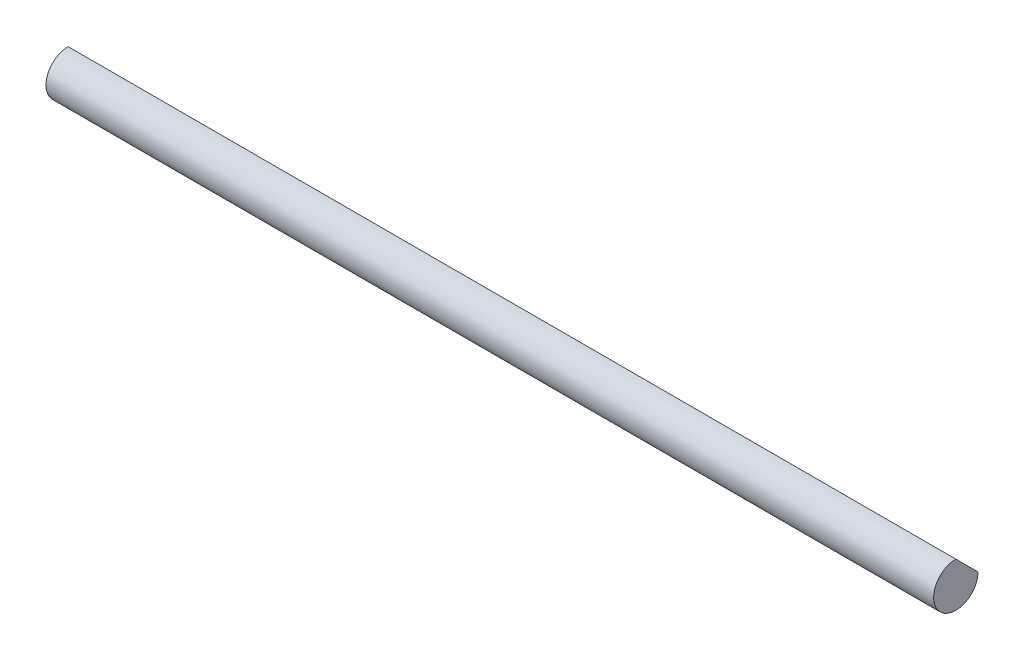
ISO-10303-21;
HEADER;
FILE_DESCRIPTION(('STEP AP214'),'2;1');
FILE_NAME('part.step','',(''),(''),'','','');
FILE_SCHEMA(('AUTOMOTIVE_DESIGN { 1 0 10303 214 1 1 1 1 }'));
ENDSEC;
DATA;
#1=APPLICATION_CONTEXT('core data for automotive mechanical design processes');
#2=APPLICATION_PROTOCOL_DEFINITION('international standard','automotive_design',2000,#1);
#3=PRODUCT_CONTEXT('',#1,'mechanical');
#4=PRODUCT('Part','Part','',(#3));
#5=PRODUCT_RELATED_PRODUCT_CATEGORY('part','',(#4));
#6=PRODUCT_DEFINITION_FORMATION('','',#4);
#7=PRODUCT_DEFINITION_CONTEXT('part definition',#1,'design');
#8=PRODUCT_DEFINITION('design','',#6,#7);
#9=PRODUCT_DEFINITION_SHAPE('','',#8);
#10=(LENGTH_UNIT() NAMED_UNIT(*) SI_UNIT(.MILLI.,.METRE.));
#11=(NAMED_UNIT(*) PLANE_ANGLE_UNIT() SI_UNIT($,.RADIAN.));
#12=(NAMED_UNIT(*) SI_UNIT($,.STERADIAN.) SOLID_ANGLE_UNIT());
#13=UNCERTAINTY_MEASURE_WITH_UNIT(LENGTH_MEASURE(1.E-05),#10,'distance_accuracy_value','');
#14=(GEOMETRIC_REPRESENTATION_CONTEXT(3) GLOBAL_UNCERTAINTY_ASSIGNED_CONTEXT((#13)) GLOBAL_UNIT_ASSIGNED_CONTEXT((#10,
#11,#12)) REPRESENTATION_CONTEXT('',''));
#15=CARTESIAN_POINT('',(0.,0.,0.));
#16=DIRECTION('',(0.,0.,1.));
#17=DIRECTION('',(1.,0.,0.));
#18=AXIS2_PLACEMENT_3D('',#15,#16,#17);
#19=CARTESIAN_POINT('',(127.,0.,0.));
#20=DIRECTION('',(-1.,0.,0.));
#21=DIRECTION('',(0.,0.,1.));
#22=AXIS2_PLACEMENT_3D('',#19,#20,#21);
#23=CYLINDRICAL_SURFACE('',#22,3.175);
#24=CARTESIAN_POINT('',(0.,0.,0.));
#25=DIRECTION('',(1.,0.,0.));
#26=DIRECTION('',(0.,0.,-1.));
#27=AXIS2_PLACEMENT_3D('',#24,#25,#26);
#28=CIRCLE('',#27,3.175);
#29=CARTESIAN_POINT('',(0.,3.175,0.));
#30=VERTEX_POINT('',#29);
#31=CARTESIAN_POINT('',(0.,0.,-3.175));
#32=VERTEX_POINT('',#31);
#33=EDGE_CURVE('E67',#30,#32,#28,.T.);
#34=ORIENTED_EDGE('',*,*,#33,.T.);
#35=DIRECTION('',(-1.,0.,0.));
#36=VECTOR('',#35,1.);
#37=CARTESIAN_POINT('',(127.,0.,-3.175));
#38=LINE('',#37,#36);
#39=CARTESIAN_POINT('',(127.,0.,-3.175));
#40=VERTEX_POINT('',#39);
#41=EDGE_CURVE('E11',#40,#32,#38,.T.);
#42=ORIENTED_EDGE('',*,*,#41,.F.);
#43=CARTESIAN_POINT('',(127.,0.,0.));
#44=DIRECTION('',(1.,0.,0.));
#45=DIRECTION('',(0.,0.,-1.));
#46=AXIS2_PLACEMENT_3D('',#43,#44,#45);
#47=CIRCLE('',#46,3.175);
#48=CARTESIAN_POINT('',(127.,3.175,0.));
#49=VERTEX_POINT('',#48);
#50=EDGE_CURVE('E66',#49,#40,#47,.T.);
#51=ORIENTED_EDGE('',*,*,#50,.F.);
#52=DIRECTION('',(-1.,0.,0.));
#53=VECTOR('',#52,1.);
#54=CARTESIAN_POINT('',(127.,3.175,0.));
#55=LINE('',#54,#53);
#56=EDGE_CURVE('E44',#49,#30,#55,.T.);
#57=ORIENTED_EDGE('',*,*,#56,.T.);
#58=EDGE_LOOP('',(#34,#42,#51,#57));
#59=FACE_BOUND('',#58,.T.);
#60=ADVANCED_FACE('F36',(#59),#23,.T.);
#61=CARTESIAN_POINT('',(127.,3.175,0.));
#62=DIRECTION('',(0.,-0.707106781186548,0.707106781186548));
#63=DIRECTION('',(0.,-0.707106781186548,-0.707106781186548));
#64=AXIS2_PLACEMENT_3D('',#61,#62,#63);
#65=PLANE('',#64);
#66=DIRECTION('',(0.,0.707106781186547,0.707106781186547));
#67=VECTOR('',#66,1.);
#68=CARTESIAN_POINT('',(0.,3.175,0.));
#69=LINE('',#68,#67);
#70=EDGE_CURVE('E59',#32,#30,#69,.T.);
#71=ORIENTED_EDGE('',*,*,#70,.T.);
#72=ORIENTED_EDGE('',*,*,#56,.F.);
#73=DIRECTION('',(0.,0.707106781186547,0.707106781186547));
#74=VECTOR('',#73,1.);
#75=CARTESIAN_POINT('',(127.,3.175,0.));
#76=LINE('',#75,#74);
#77=EDGE_CURVE('E51',#40,#49,#76,.T.);
#78=ORIENTED_EDGE('',*,*,#77,.F.);
#79=ORIENTED_EDGE('',*,*,#41,.T.);
#80=EDGE_LOOP('',(#71,#72,#78,#79));
#81=FACE_BOUND('',#80,.T.);
#82=ADVANCED_FACE('F62',(#81),#65,.F.);
#83=CARTESIAN_POINT('',(127.,0.,0.));
#84=DIRECTION('',(1.,0.,0.));
#85=DIRECTION('',(0.,0.,-1.));
#86=AXIS2_PLACEMENT_3D('',#83,#84,#85);
#87=PLANE('',#86);
#88=ORIENTED_EDGE('',*,*,#50,.T.);
#89=ORIENTED_EDGE('',*,*,#77,.T.);
#90=EDGE_LOOP('',(#88,#89));
#91=FACE_BOUND('',#90,.T.);
#92=ADVANCED_FACE('F74',(#91),#87,.T.);
#93=CARTESIAN_POINT('',(0.,0.,0.));
#94=DIRECTION('',(1.,0.,0.));
#95=DIRECTION('',(0.,0.,-1.));
#96=AXIS2_PLACEMENT_3D('',#93,#94,#95);
#97=PLANE('',#96);
#98=ORIENTED_EDGE('',*,*,#33,.F.);
#99=ORIENTED_EDGE('',*,*,#70,.F.);
#100=EDGE_LOOP('',(#98,#99));
#101=FACE_BOUND('',#100,.T.);
#102=ADVANCED_FACE('F70',(#101),#97,.F.);
#103=CLOSED_SHELL('',(#60,#82,#92,#102));
#104=MANIFOLD_SOLID_BREP('B2',#103);
#105=ADVANCED_BREP_SHAPE_REPRESENTATION('',(#18,#104),#14);
#106=SHAPE_DEFINITION_REPRESENTATION(#9,#105);
ENDSEC;
END-ISO-10303-21;
